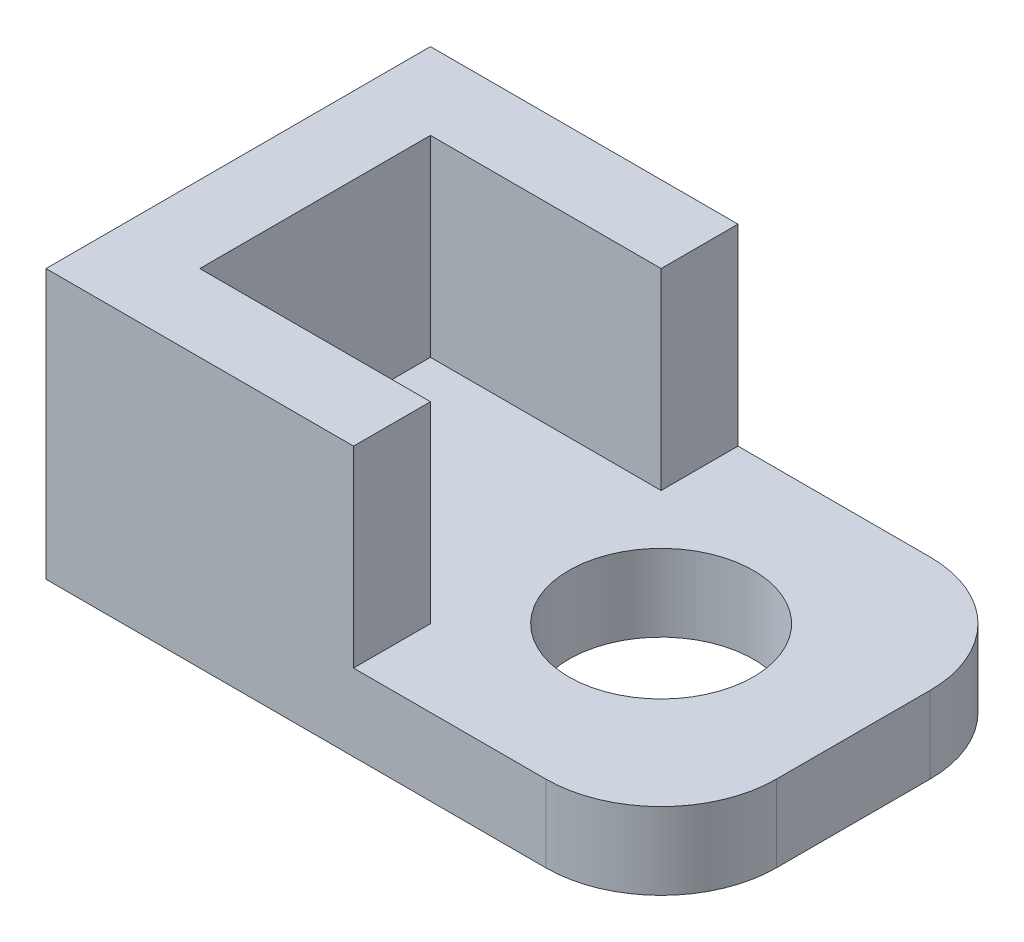
ISO-10303-21;
HEADER;
FILE_DESCRIPTION(('STEP AP214'),'2;1');
FILE_NAME('part.step','',(''),(''),'','','');
FILE_SCHEMA(('AUTOMOTIVE_DESIGN { 1 0 10303 214 1 1 1 1 }'));
ENDSEC;
DATA;
#1=APPLICATION_CONTEXT('core data for automotive mechanical design processes');
#2=APPLICATION_PROTOCOL_DEFINITION('international standard','automotive_design',2000,#1);
#3=PRODUCT_CONTEXT('',#1,'mechanical');
#4=PRODUCT('Part','Part','',(#3));
#5=PRODUCT_RELATED_PRODUCT_CATEGORY('part','',(#4));
#6=PRODUCT_DEFINITION_FORMATION('','',#4);
#7=PRODUCT_DEFINITION_CONTEXT('part definition',#1,'design');
#8=PRODUCT_DEFINITION('design','',#6,#7);
#9=PRODUCT_DEFINITION_SHAPE('','',#8);
#10=(LENGTH_UNIT() NAMED_UNIT(*) SI_UNIT(.MILLI.,.METRE.));
#11=(NAMED_UNIT(*) PLANE_ANGLE_UNIT() SI_UNIT($,.RADIAN.));
#12=(NAMED_UNIT(*) SI_UNIT($,.STERADIAN.) SOLID_ANGLE_UNIT());
#13=UNCERTAINTY_MEASURE_WITH_UNIT(LENGTH_MEASURE(1.E-05),#10,'distance_accuracy_value','');
#14=(GEOMETRIC_REPRESENTATION_CONTEXT(3) GLOBAL_UNCERTAINTY_ASSIGNED_CONTEXT((#13)) GLOBAL_UNIT_ASSIGNED_CONTEXT((#10,
#11,#12)) REPRESENTATION_CONTEXT('',''));
#15=CARTESIAN_POINT('',(0.,0.,0.));
#16=DIRECTION('',(0.,0.,1.));
#17=DIRECTION('',(1.,0.,0.));
#18=AXIS2_PLACEMENT_3D('',#15,#16,#17);
#19=CARTESIAN_POINT('',(0.,10.,25.));
#20=DIRECTION('',(0.,0.,-1.));
#21=DIRECTION('',(-1.,0.,0.));
#22=AXIS2_PLACEMENT_3D('',#19,#20,#21);
#23=PLANE('',#22);
#24=DIRECTION('',(1.,0.,0.));
#25=VECTOR('',#24,1.);
#26=CARTESIAN_POINT('',(0.,0.,25.));
#27=LINE('',#26,#25);
#28=CARTESIAN_POINT('',(-40.,0.,25.));
#29=VERTEX_POINT('',#28);
#30=CARTESIAN_POINT('',(25.,0.,25.));
#31=VERTEX_POINT('',#30);
#32=EDGE_CURVE('E214',#29,#31,#27,.T.);
#33=ORIENTED_EDGE('',*,*,#32,.T.);
#34=DIRECTION('',(0.,-1.,0.));
#35=VECTOR('',#34,1.);
#36=CARTESIAN_POINT('',(25.,10.,25.));
#37=LINE('',#36,#35);
#38=CARTESIAN_POINT('',(25.,10.,25.));
#39=VERTEX_POINT('',#38);
#40=EDGE_CURVE('E11',#31,#39,#37,.F.);
#41=ORIENTED_EDGE('',*,*,#40,.T.);
#42=DIRECTION('',(1.,0.,0.));
#43=VECTOR('',#42,1.);
#44=CARTESIAN_POINT('',(0.,10.,25.));
#45=LINE('',#44,#43);
#46=CARTESIAN_POINT('',(0.,10.,25.));
#47=VERTEX_POINT('',#46);
#48=EDGE_CURVE('E198',#47,#39,#45,.T.);
#49=ORIENTED_EDGE('',*,*,#48,.F.);
#50=DIRECTION('',(0.,-1.,0.));
#51=VECTOR('',#50,1.);
#52=CARTESIAN_POINT('',(0.,35.,25.));
#53=LINE('',#52,#51);
#54=CARTESIAN_POINT('',(0.,35.,25.));
#55=VERTEX_POINT('',#54);
#56=EDGE_CURVE('E171',#55,#47,#53,.T.);
#57=ORIENTED_EDGE('',*,*,#56,.F.);
#58=DIRECTION('',(1.,0.,0.));
#59=VECTOR('',#58,1.);
#60=CARTESIAN_POINT('',(0.,35.,25.));
#61=LINE('',#60,#59);
#62=CARTESIAN_POINT('',(-40.,35.,25.));
#63=VERTEX_POINT('',#62);
#64=EDGE_CURVE('E149',#63,#55,#61,.T.);
#65=ORIENTED_EDGE('',*,*,#64,.F.);
#66=DIRECTION('',(0.,-1.,0.));
#67=VECTOR('',#66,1.);
#68=CARTESIAN_POINT('',(-40.,35.,25.));
#69=LINE('',#68,#67);
#70=EDGE_CURVE('E175',#63,#29,#69,.T.);
#71=ORIENTED_EDGE('',*,*,#70,.T.);
#72=EDGE_LOOP('',(#33,#41,#49,#57,#65,#71));
#73=FACE_BOUND('',#72,.T.);
#74=ADVANCED_FACE('F39',(#73),#23,.F.);
#75=CARTESIAN_POINT('',(40.,10.,0.));
#76=DIRECTION('',(1.,0.,0.));
#77=DIRECTION('',(0.,0.,-1.));
#78=AXIS2_PLACEMENT_3D('',#75,#76,#77);
#79=PLANE('',#78);
#80=DIRECTION('',(0.,0.,1.));
#81=VECTOR('',#80,1.);
#82=CARTESIAN_POINT('',(40.,0.,0.));
#83=LINE('',#82,#81);
#84=CARTESIAN_POINT('',(40.,0.,-10.));
#85=VERTEX_POINT('',#84);
#86=CARTESIAN_POINT('',(40.,0.,10.));
#87=VERTEX_POINT('',#86);
#88=EDGE_CURVE('E216',#85,#87,#83,.T.);
#89=ORIENTED_EDGE('',*,*,#88,.F.);
#90=DIRECTION('',(0.,-1.,0.));
#91=VECTOR('',#90,1.);
#92=CARTESIAN_POINT('',(40.,10.,-10.));
#93=LINE('',#92,#91);
#94=CARTESIAN_POINT('',(40.,10.,-10.));
#95=VERTEX_POINT('',#94);
#96=EDGE_CURVE('E230',#85,#95,#93,.F.);
#97=ORIENTED_EDGE('',*,*,#96,.T.);
#98=DIRECTION('',(0.,0.,1.));
#99=VECTOR('',#98,1.);
#100=CARTESIAN_POINT('',(40.,10.,0.));
#101=LINE('',#100,#99);
#102=CARTESIAN_POINT('',(40.,10.,10.));
#103=VERTEX_POINT('',#102);
#104=EDGE_CURVE('E200',#95,#103,#101,.T.);
#105=ORIENTED_EDGE('',*,*,#104,.T.);
#106=DIRECTION('',(0.,-1.,0.));
#107=VECTOR('',#106,1.);
#108=CARTESIAN_POINT('',(40.,0.,10.));
#109=LINE('',#108,#107);
#110=EDGE_CURVE('E227',#103,#87,#109,.T.);
#111=ORIENTED_EDGE('',*,*,#110,.T.);
#112=EDGE_LOOP('',(#89,#97,#105,#111));
#113=FACE_BOUND('',#112,.T.);
#114=ADVANCED_FACE('F247',(#113),#79,.T.);
#115=CARTESIAN_POINT('',(0.,10.,-25.));
#116=DIRECTION('',(0.,0.,-1.));
#117=DIRECTION('',(-1.,0.,0.));
#118=AXIS2_PLACEMENT_3D('',#115,#116,#117);
#119=PLANE('',#118);
#120=DIRECTION('',(1.,0.,0.));
#121=VECTOR('',#120,1.);
#122=CARTESIAN_POINT('',(0.,10.,-25.));
#123=LINE('',#122,#121);
#124=CARTESIAN_POINT('',(0.,10.,-25.));
#125=VERTEX_POINT('',#124);
#126=CARTESIAN_POINT('',(25.,10.,-25.));
#127=VERTEX_POINT('',#126);
#128=EDGE_CURVE('E202',#125,#127,#123,.T.);
#129=ORIENTED_EDGE('',*,*,#128,.T.);
#130=DIRECTION('',(0.,-1.,0.));
#131=VECTOR('',#130,1.);
#132=CARTESIAN_POINT('',(25.,10.,-25.));
#133=LINE('',#132,#131);
#134=CARTESIAN_POINT('',(25.,0.,-25.));
#135=VERTEX_POINT('',#134);
#136=EDGE_CURVE('E211',#127,#135,#133,.T.);
#137=ORIENTED_EDGE('',*,*,#136,.T.);
#138=DIRECTION('',(1.,0.,0.));
#139=VECTOR('',#138,1.);
#140=CARTESIAN_POINT('',(0.,0.,-25.));
#141=LINE('',#140,#139);
#142=CARTESIAN_POINT('',(-40.,0.,-25.));
#143=VERTEX_POINT('',#142);
#144=EDGE_CURVE('E195',#143,#135,#141,.T.);
#145=ORIENTED_EDGE('',*,*,#144,.F.);
#146=DIRECTION('',(0.,-1.,0.));
#147=VECTOR('',#146,1.);
#148=CARTESIAN_POINT('',(-40.,35.,-25.));
#149=LINE('',#148,#147);
#150=CARTESIAN_POINT('',(-40.,35.,-25.));
#151=VERTEX_POINT('',#150);
#152=EDGE_CURVE('E178',#151,#143,#149,.T.);
#153=ORIENTED_EDGE('',*,*,#152,.F.);
#154=DIRECTION('',(1.,0.,0.));
#155=VECTOR('',#154,1.);
#156=CARTESIAN_POINT('',(0.,35.,-25.));
#157=LINE('',#156,#155);
#158=CARTESIAN_POINT('',(0.,35.,-25.));
#159=VERTEX_POINT('',#158);
#160=EDGE_CURVE('E165',#151,#159,#157,.T.);
#161=ORIENTED_EDGE('',*,*,#160,.T.);
#162=DIRECTION('',(0.,-1.,0.));
#163=VECTOR('',#162,1.);
#164=CARTESIAN_POINT('',(0.,35.,-25.));
#165=LINE('',#164,#163);
#166=EDGE_CURVE('E181',#159,#125,#165,.T.);
#167=ORIENTED_EDGE('',*,*,#166,.T.);
#168=EDGE_LOOP('',(#129,#137,#145,#153,#161,#167));
#169=FACE_BOUND('',#168,.T.);
#170=ADVANCED_FACE('F239',(#169),#119,.T.);
#171=CARTESIAN_POINT('',(15.,10.,0.));
#172=DIRECTION('',(0.,-1.,0.));
#173=DIRECTION('',(0.,0.,-1.));
#174=AXIS2_PLACEMENT_3D('',#171,#172,#173);
#175=CYLINDRICAL_SURFACE('',#174,12.);
#176=CARTESIAN_POINT('',(15.,10.,0.));
#177=DIRECTION('',(0.,1.,0.));
#178=DIRECTION('',(0.,0.,1.));
#179=AXIS2_PLACEMENT_3D('',#176,#177,#178);
#180=CIRCLE('',#179,12.);
#181=CARTESIAN_POINT('',(15.,10.,12.));
#182=VERTEX_POINT('',#181);
#183=EDGE_CURVE('E191',#182,#182,#180,.T.);
#184=ORIENTED_EDGE('',*,*,#183,.T.);
#185=EDGE_LOOP('',(#184));
#186=FACE_BOUND('',#185,.T.);
#187=CARTESIAN_POINT('',(15.,0.,0.));
#188=DIRECTION('',(0.,1.,0.));
#189=DIRECTION('',(0.,0.,1.));
#190=AXIS2_PLACEMENT_3D('',#187,#188,#189);
#191=CIRCLE('',#190,12.);
#192=CARTESIAN_POINT('',(15.,0.,12.));
#193=VERTEX_POINT('',#192);
#194=EDGE_CURVE('E139',#193,#193,#191,.T.);
#195=ORIENTED_EDGE('',*,*,#194,.F.);
#196=EDGE_LOOP('',(#195));
#197=FACE_BOUND('',#196,.T.);
#198=ADVANCED_FACE('F281',(#186,#197),#175,.F.);
#199=CARTESIAN_POINT('',(0.,10.,0.));
#200=DIRECTION('',(0.,1.,0.));
#201=DIRECTION('',(0.,0.,1.));
#202=AXIS2_PLACEMENT_3D('',#199,#200,#201);
#203=PLANE('',#202);
#204=ORIENTED_EDGE('',*,*,#183,.F.);
#205=EDGE_LOOP('',(#204));
#206=FACE_BOUND('',#205,.T.);
#207=ORIENTED_EDGE('',*,*,#104,.F.);
#208=CARTESIAN_POINT('',(25.,10.,-9.99999999999999));
#209=DIRECTION('',(0.,1.,0.));
#210=DIRECTION('',(0.,0.,1.));
#211=AXIS2_PLACEMENT_3D('',#208,#209,#210);
#212=CIRCLE('',#211,15.);
#213=EDGE_CURVE('E47',#95,#127,#212,.T.);
#214=ORIENTED_EDGE('',*,*,#213,.T.);
#215=ORIENTED_EDGE('',*,*,#128,.F.);
#216=DIRECTION('',(0.,0.,1.));
#217=VECTOR('',#216,1.);
#218=CARTESIAN_POINT('',(0.,10.,0.));
#219=LINE('',#218,#217);
#220=CARTESIAN_POINT('',(0.,10.,-15.));
#221=VERTEX_POINT('',#220);
#222=EDGE_CURVE('E205',#125,#221,#219,.T.);
#223=ORIENTED_EDGE('',*,*,#222,.T.);
#224=DIRECTION('',(-1.,0.,0.));
#225=VECTOR('',#224,1.);
#226=CARTESIAN_POINT('',(0.,10.,-15.));
#227=LINE('',#226,#225);
#228=CARTESIAN_POINT('',(-30.,10.,-15.));
#229=VERTEX_POINT('',#228);
#230=EDGE_CURVE('E207',#221,#229,#227,.T.);
#231=ORIENTED_EDGE('',*,*,#230,.T.);
#232=DIRECTION('',(0.,0.,1.));
#233=VECTOR('',#232,1.);
#234=CARTESIAN_POINT('',(-30.,10.,0.));
#235=LINE('',#234,#233);
#236=CARTESIAN_POINT('',(-30.,10.,15.));
#237=VERTEX_POINT('',#236);
#238=EDGE_CURVE('E209',#229,#237,#235,.T.);
#239=ORIENTED_EDGE('',*,*,#238,.T.);
#240=DIRECTION('',(1.,0.,0.));
#241=VECTOR('',#240,1.);
#242=CARTESIAN_POINT('',(0.,10.,15.));
#243=LINE('',#242,#241);
#244=CARTESIAN_POINT('',(0.,10.,15.));
#245=VERTEX_POINT('',#244);
#246=EDGE_CURVE('E194',#237,#245,#243,.T.);
#247=ORIENTED_EDGE('',*,*,#246,.T.);
#248=DIRECTION('',(0.,0.,1.));
#249=VECTOR('',#248,1.);
#250=CARTESIAN_POINT('',(0.,10.,0.));
#251=LINE('',#250,#249);
#252=EDGE_CURVE('E135',#245,#47,#251,.T.);
#253=ORIENTED_EDGE('',*,*,#252,.T.);
#254=ORIENTED_EDGE('',*,*,#48,.T.);
#255=CARTESIAN_POINT('',(25.,10.,10.));
#256=DIRECTION('',(0.,1.,0.));
#257=DIRECTION('',(0.,0.,1.));
#258=AXIS2_PLACEMENT_3D('',#255,#256,#257);
#259=CIRCLE('',#258,15.);
#260=EDGE_CURVE('E59',#39,#103,#259,.T.);
#261=ORIENTED_EDGE('',*,*,#260,.T.);
#262=EDGE_LOOP('',(#207,#214,#215,#223,#231,#239,#247,#253,#254,#261));
#263=FACE_BOUND('',#262,.T.);
#264=ADVANCED_FACE('F233',(#206,#263),#203,.T.);
#265=CARTESIAN_POINT('',(0.,0.,0.));
#266=DIRECTION('',(0.,1.,0.));
#267=DIRECTION('',(0.,0.,1.));
#268=AXIS2_PLACEMENT_3D('',#265,#266,#267);
#269=PLANE('',#268);
#270=ORIENTED_EDGE('',*,*,#144,.T.);
#271=CARTESIAN_POINT('',(25.,0.,-9.99999999999999));
#272=DIRECTION('',(0.,1.,0.));
#273=DIRECTION('',(0.,0.,1.));
#274=AXIS2_PLACEMENT_3D('',#271,#272,#273);
#275=CIRCLE('',#274,15.);
#276=EDGE_CURVE('E225',#135,#85,#275,.F.);
#277=ORIENTED_EDGE('',*,*,#276,.T.);
#278=ORIENTED_EDGE('',*,*,#88,.T.);
#279=CARTESIAN_POINT('',(25.,0.,10.));
#280=DIRECTION('',(0.,1.,0.));
#281=DIRECTION('',(0.,0.,1.));
#282=AXIS2_PLACEMENT_3D('',#279,#280,#281);
#283=CIRCLE('',#282,15.);
#284=EDGE_CURVE('E223',#87,#31,#283,.F.);
#285=ORIENTED_EDGE('',*,*,#284,.T.);
#286=ORIENTED_EDGE('',*,*,#32,.F.);
#287=DIRECTION('',(0.,0.,1.));
#288=VECTOR('',#287,1.);
#289=CARTESIAN_POINT('',(-40.,0.,0.));
#290=LINE('',#289,#288);
#291=EDGE_CURVE('E151',#143,#29,#290,.T.);
#292=ORIENTED_EDGE('',*,*,#291,.F.);
#293=EDGE_LOOP('',(#270,#277,#278,#285,#286,#292));
#294=FACE_BOUND('',#293,.T.);
#295=ORIENTED_EDGE('',*,*,#194,.T.);
#296=EDGE_LOOP('',(#295));
#297=FACE_BOUND('',#296,.T.);
#298=ADVANCED_FACE('F243',(#294,#297),#269,.F.);
#299=CARTESIAN_POINT('',(0.,35.,0.));
#300=DIRECTION('',(1.,0.,0.));
#301=DIRECTION('',(0.,0.,-1.));
#302=AXIS2_PLACEMENT_3D('',#299,#300,#301);
#303=PLANE('',#302);
#304=ORIENTED_EDGE('',*,*,#56,.T.);
#305=ORIENTED_EDGE('',*,*,#252,.F.);
#306=DIRECTION('',(0.,-1.,0.));
#307=VECTOR('',#306,1.);
#308=CARTESIAN_POINT('',(0.,35.,15.));
#309=LINE('',#308,#307);
#310=CARTESIAN_POINT('',(0.,35.,15.));
#311=VERTEX_POINT('',#310);
#312=EDGE_CURVE('E130',#311,#245,#309,.T.);
#313=ORIENTED_EDGE('',*,*,#312,.F.);
#314=DIRECTION('',(0.,0.,1.));
#315=VECTOR('',#314,1.);
#316=CARTESIAN_POINT('',(0.,35.,0.));
#317=LINE('',#316,#315);
#318=EDGE_CURVE('E134',#311,#55,#317,.T.);
#319=ORIENTED_EDGE('',*,*,#318,.T.);
#320=EDGE_LOOP('',(#304,#305,#313,#319));
#321=FACE_BOUND('',#320,.T.);
#322=ADVANCED_FACE('F133',(#321),#303,.T.);
#323=CARTESIAN_POINT('',(0.,35.,15.));
#324=DIRECTION('',(0.,0.,-1.));
#325=DIRECTION('',(-1.,0.,0.));
#326=AXIS2_PLACEMENT_3D('',#323,#324,#325);
#327=PLANE('',#326);
#328=ORIENTED_EDGE('',*,*,#312,.T.);
#329=ORIENTED_EDGE('',*,*,#246,.F.);
#330=DIRECTION('',(0.,-1.,0.));
#331=VECTOR('',#330,1.);
#332=CARTESIAN_POINT('',(-30.,35.,15.));
#333=LINE('',#332,#331);
#334=CARTESIAN_POINT('',(-30.,35.,15.));
#335=VERTEX_POINT('',#334);
#336=EDGE_CURVE('E140',#335,#237,#333,.T.);
#337=ORIENTED_EDGE('',*,*,#336,.F.);
#338=DIRECTION('',(1.,0.,0.));
#339=VECTOR('',#338,1.);
#340=CARTESIAN_POINT('',(0.,35.,15.));
#341=LINE('',#340,#339);
#342=EDGE_CURVE('E146',#335,#311,#341,.T.);
#343=ORIENTED_EDGE('',*,*,#342,.T.);
#344=EDGE_LOOP('',(#328,#329,#337,#343));
#345=FACE_BOUND('',#344,.T.);
#346=ADVANCED_FACE('F153',(#345),#327,.T.);
#347=CARTESIAN_POINT('',(-30.,35.,0.));
#348=DIRECTION('',(1.,0.,0.));
#349=DIRECTION('',(0.,0.,-1.));
#350=AXIS2_PLACEMENT_3D('',#347,#348,#349);
#351=PLANE('',#350);
#352=ORIENTED_EDGE('',*,*,#336,.T.);
#353=ORIENTED_EDGE('',*,*,#238,.F.);
#354=DIRECTION('',(0.,-1.,0.));
#355=VECTOR('',#354,1.);
#356=CARTESIAN_POINT('',(-30.,35.,-15.));
#357=LINE('',#356,#355);
#358=CARTESIAN_POINT('',(-30.,35.,-15.));
#359=VERTEX_POINT('',#358);
#360=EDGE_CURVE('E187',#359,#229,#357,.T.);
#361=ORIENTED_EDGE('',*,*,#360,.F.);
#362=DIRECTION('',(0.,0.,1.));
#363=VECTOR('',#362,1.);
#364=CARTESIAN_POINT('',(-30.,35.,0.));
#365=LINE('',#364,#363);
#366=EDGE_CURVE('E155',#359,#335,#365,.T.);
#367=ORIENTED_EDGE('',*,*,#366,.T.);
#368=EDGE_LOOP('',(#352,#353,#361,#367));
#369=FACE_BOUND('',#368,.T.);
#370=ADVANCED_FACE('F264',(#369),#351,.T.);
#371=CARTESIAN_POINT('',(0.,35.,-15.));
#372=DIRECTION('',(0.,0.,1.));
#373=DIRECTION('',(1.,0.,0.));
#374=AXIS2_PLACEMENT_3D('',#371,#372,#373);
#375=PLANE('',#374);
#376=ORIENTED_EDGE('',*,*,#360,.T.);
#377=ORIENTED_EDGE('',*,*,#230,.F.);
#378=DIRECTION('',(0.,-1.,0.));
#379=VECTOR('',#378,1.);
#380=CARTESIAN_POINT('',(0.,35.,-15.));
#381=LINE('',#380,#379);
#382=CARTESIAN_POINT('',(0.,35.,-15.));
#383=VERTEX_POINT('',#382);
#384=EDGE_CURVE('E184',#383,#221,#381,.T.);
#385=ORIENTED_EDGE('',*,*,#384,.F.);
#386=DIRECTION('',(-1.,0.,0.));
#387=VECTOR('',#386,1.);
#388=CARTESIAN_POINT('',(0.,35.,-15.));
#389=LINE('',#388,#387);
#390=EDGE_CURVE('E157',#383,#359,#389,.T.);
#391=ORIENTED_EDGE('',*,*,#390,.T.);
#392=EDGE_LOOP('',(#376,#377,#385,#391));
#393=FACE_BOUND('',#392,.T.);
#394=ADVANCED_FACE('F262',(#393),#375,.T.);
#395=CARTESIAN_POINT('',(0.,35.,0.));
#396=DIRECTION('',(1.,0.,0.));
#397=DIRECTION('',(0.,0.,-1.));
#398=AXIS2_PLACEMENT_3D('',#395,#396,#397);
#399=PLANE('',#398);
#400=ORIENTED_EDGE('',*,*,#384,.T.);
#401=ORIENTED_EDGE('',*,*,#222,.F.);
#402=ORIENTED_EDGE('',*,*,#166,.F.);
#403=DIRECTION('',(0.,0.,1.));
#404=VECTOR('',#403,1.);
#405=CARTESIAN_POINT('',(0.,35.,0.));
#406=LINE('',#405,#404);
#407=EDGE_CURVE('E162',#159,#383,#406,.T.);
#408=ORIENTED_EDGE('',*,*,#407,.T.);
#409=EDGE_LOOP('',(#400,#401,#402,#408));
#410=FACE_BOUND('',#409,.T.);
#411=ADVANCED_FACE('F258',(#410),#399,.T.);
#412=CARTESIAN_POINT('',(-40.,35.,0.));
#413=DIRECTION('',(1.,0.,0.));
#414=DIRECTION('',(0.,0.,-1.));
#415=AXIS2_PLACEMENT_3D('',#412,#413,#414);
#416=PLANE('',#415);
#417=ORIENTED_EDGE('',*,*,#291,.T.);
#418=ORIENTED_EDGE('',*,*,#70,.F.);
#419=DIRECTION('',(0.,0.,1.));
#420=VECTOR('',#419,1.);
#421=CARTESIAN_POINT('',(-40.,35.,0.));
#422=LINE('',#421,#420);
#423=EDGE_CURVE('E168',#151,#63,#422,.T.);
#424=ORIENTED_EDGE('',*,*,#423,.F.);
#425=ORIENTED_EDGE('',*,*,#152,.T.);
#426=EDGE_LOOP('',(#417,#418,#424,#425));
#427=FACE_BOUND('',#426,.T.);
#428=ADVANCED_FACE('F253',(#427),#416,.F.);
#429=CARTESIAN_POINT('',(0.,35.,0.));
#430=DIRECTION('',(0.,1.,0.));
#431=DIRECTION('',(0.,0.,1.));
#432=AXIS2_PLACEMENT_3D('',#429,#430,#431);
#433=PLANE('',#432);
#434=ORIENTED_EDGE('',*,*,#318,.F.);
#435=ORIENTED_EDGE('',*,*,#342,.F.);
#436=ORIENTED_EDGE('',*,*,#366,.F.);
#437=ORIENTED_EDGE('',*,*,#390,.F.);
#438=ORIENTED_EDGE('',*,*,#407,.F.);
#439=ORIENTED_EDGE('',*,*,#160,.F.);
#440=ORIENTED_EDGE('',*,*,#423,.T.);
#441=ORIENTED_EDGE('',*,*,#64,.T.);
#442=EDGE_LOOP('',(#434,#435,#436,#437,#438,#439,#440,#441));
#443=FACE_BOUND('',#442,.T.);
#444=ADVANCED_FACE('F144',(#443),#433,.T.);
#445=CARTESIAN_POINT('',(25.,10.,-9.99999999999999));
#446=DIRECTION('',(0.,-1.,0.));
#447=DIRECTION('',(0.,0.,-1.));
#448=AXIS2_PLACEMENT_3D('',#445,#446,#447);
#449=CYLINDRICAL_SURFACE('',#448,15.);
#450=ORIENTED_EDGE('',*,*,#213,.F.);
#451=ORIENTED_EDGE('',*,*,#96,.F.);
#452=ORIENTED_EDGE('',*,*,#276,.F.);
#453=ORIENTED_EDGE('',*,*,#136,.F.);
#454=EDGE_LOOP('',(#450,#451,#452,#453));
#455=FACE_BOUND('',#454,.T.);
#456=ADVANCED_FACE('F240',(#455),#449,.T.);
#457=CARTESIAN_POINT('',(25.,10.,10.));
#458=DIRECTION('',(0.,1.,0.));
#459=DIRECTION('',(0.,0.,1.));
#460=AXIS2_PLACEMENT_3D('',#457,#458,#459);
#461=CYLINDRICAL_SURFACE('',#460,15.);
#462=ORIENTED_EDGE('',*,*,#260,.F.);
#463=ORIENTED_EDGE('',*,*,#40,.F.);
#464=ORIENTED_EDGE('',*,*,#284,.F.);
#465=ORIENTED_EDGE('',*,*,#110,.F.);
#466=EDGE_LOOP('',(#462,#463,#464,#465));
#467=FACE_BOUND('',#466,.T.);
#468=ADVANCED_FACE('F41',(#467),#461,.T.);
#469=CLOSED_SHELL('',(#74,#114,#170,#198,#264,#298,#322,#346,#370,#394,#411,#428,#444,#456,#468));
#470=MANIFOLD_SOLID_BREP('B2',#469);
#471=ADVANCED_BREP_SHAPE_REPRESENTATION('',(#18,#470),#14);
#472=SHAPE_DEFINITION_REPRESENTATION(#9,#471);
ENDSEC;
END-ISO-10303-21;
